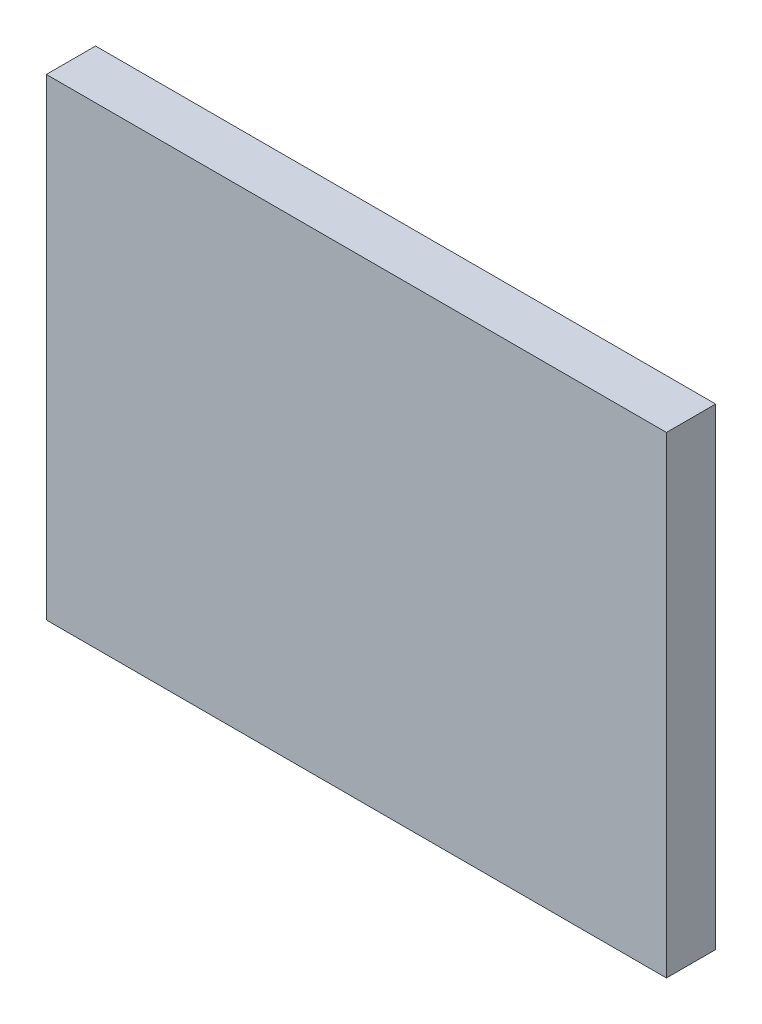
ISO-10303-21;
HEADER;
FILE_DESCRIPTION(('STEP AP214'),'2;1');
FILE_NAME('part.step','',(''),(''),'','','');
FILE_SCHEMA(('AUTOMOTIVE_DESIGN { 1 0 10303 214 1 1 1 1 }'));
ENDSEC;
DATA;
#1=APPLICATION_CONTEXT('core data for automotive mechanical design processes');
#2=APPLICATION_PROTOCOL_DEFINITION('international standard','automotive_design',2000,#1);
#3=PRODUCT_CONTEXT('',#1,'mechanical');
#4=PRODUCT('Part','Part','',(#3));
#5=PRODUCT_RELATED_PRODUCT_CATEGORY('part','',(#4));
#6=PRODUCT_DEFINITION_FORMATION('','',#4);
#7=PRODUCT_DEFINITION_CONTEXT('part definition',#1,'design');
#8=PRODUCT_DEFINITION('design','',#6,#7);
#9=PRODUCT_DEFINITION_SHAPE('','',#8);
#10=(LENGTH_UNIT() NAMED_UNIT(*) SI_UNIT(.MILLI.,.METRE.));
#11=(NAMED_UNIT(*) PLANE_ANGLE_UNIT() SI_UNIT($,.RADIAN.));
#12=(NAMED_UNIT(*) SI_UNIT($,.STERADIAN.) SOLID_ANGLE_UNIT());
#13=UNCERTAINTY_MEASURE_WITH_UNIT(LENGTH_MEASURE(1.E-05),#10,'distance_accuracy_value','');
#14=(GEOMETRIC_REPRESENTATION_CONTEXT(3) GLOBAL_UNCERTAINTY_ASSIGNED_CONTEXT((#13)) GLOBAL_UNIT_ASSIGNED_CONTEXT((#10,
#11,#12)) REPRESENTATION_CONTEXT('',''));
#15=CARTESIAN_POINT('',(0.,0.,0.));
#16=DIRECTION('',(0.,0.,1.));
#17=DIRECTION('',(1.,0.,0.));
#18=AXIS2_PLACEMENT_3D('',#15,#16,#17);
#19=CARTESIAN_POINT('',(1.27,-1.58,0.));
#20=DIRECTION('',(1.,0.,0.));
#21=DIRECTION('',(0.,0.,1.));
#22=AXIS2_PLACEMENT_3D('',#19,#20,#21);
#23=PLANE('',#22);
#24=DIRECTION('',(0.,1.,0.));
#25=VECTOR('',#24,1.);
#26=CARTESIAN_POINT('',(1.27,-1.58,0.1));
#27=LINE('',#26,#25);
#28=CARTESIAN_POINT('',(1.27,-1.58,0.1));
#29=VERTEX_POINT('',#28);
#30=CARTESIAN_POINT('',(1.27,-0.62,0.1));
#31=VERTEX_POINT('',#30);
#32=EDGE_CURVE('E11',#29,#31,#27,.T.);
#33=ORIENTED_EDGE('',*,*,#32,.T.);
#34=DIRECTION('',(0.,0.,1.));
#35=VECTOR('',#34,1.);
#36=CARTESIAN_POINT('',(1.27,-0.62,0.));
#37=LINE('',#36,#35);
#38=CARTESIAN_POINT('',(1.27,-0.62,0.));
#39=VERTEX_POINT('',#38);
#40=EDGE_CURVE('E23',#39,#31,#37,.T.);
#41=ORIENTED_EDGE('',*,*,#40,.F.);
#42=DIRECTION('',(0.,1.,0.));
#43=VECTOR('',#42,1.);
#44=CARTESIAN_POINT('',(1.27,-1.58,0.));
#45=LINE('',#44,#43);
#46=CARTESIAN_POINT('',(1.27,-1.58,0.));
#47=VERTEX_POINT('',#46);
#48=EDGE_CURVE('E85',#47,#39,#45,.T.);
#49=ORIENTED_EDGE('',*,*,#48,.F.);
#50=DIRECTION('',(0.,0.,1.));
#51=VECTOR('',#50,1.);
#52=CARTESIAN_POINT('',(1.27,-1.58,0.));
#53=LINE('',#52,#51);
#54=EDGE_CURVE('E35',#47,#29,#53,.T.);
#55=ORIENTED_EDGE('',*,*,#54,.T.);
#56=EDGE_LOOP('',(#33,#41,#49,#55));
#57=FACE_BOUND('',#56,.T.);
#58=ADVANCED_FACE('F16',(#57),#23,.F.);
#59=CARTESIAN_POINT('',(2.53,-1.58,0.));
#60=DIRECTION('',(1.,0.,0.));
#61=DIRECTION('',(0.,0.,1.));
#62=AXIS2_PLACEMENT_3D('',#59,#60,#61);
#63=PLANE('',#62);
#64=DIRECTION('',(0.,0.,1.));
#65=VECTOR('',#64,1.);
#66=CARTESIAN_POINT('',(2.53,-1.58,0.));
#67=LINE('',#66,#65);
#68=CARTESIAN_POINT('',(2.53,-1.58,0.));
#69=VERTEX_POINT('',#68);
#70=CARTESIAN_POINT('',(2.53,-1.58,0.1));
#71=VERTEX_POINT('',#70);
#72=EDGE_CURVE('E82',#69,#71,#67,.T.);
#73=ORIENTED_EDGE('',*,*,#72,.F.);
#74=DIRECTION('',(0.,1.,0.));
#75=VECTOR('',#74,1.);
#76=CARTESIAN_POINT('',(2.53,-1.58,0.));
#77=LINE('',#76,#75);
#78=CARTESIAN_POINT('',(2.53,-0.62,0.));
#79=VERTEX_POINT('',#78);
#80=EDGE_CURVE('E62',#69,#79,#77,.T.);
#81=ORIENTED_EDGE('',*,*,#80,.T.);
#82=DIRECTION('',(0.,0.,1.));
#83=VECTOR('',#82,1.);
#84=CARTESIAN_POINT('',(2.53,-0.62,0.));
#85=LINE('',#84,#83);
#86=CARTESIAN_POINT('',(2.53,-0.62,0.1));
#87=VERTEX_POINT('',#86);
#88=EDGE_CURVE('E56',#79,#87,#85,.T.);
#89=ORIENTED_EDGE('',*,*,#88,.T.);
#90=DIRECTION('',(0.,1.,0.));
#91=VECTOR('',#90,1.);
#92=CARTESIAN_POINT('',(2.53,-1.58,0.1));
#93=LINE('',#92,#91);
#94=EDGE_CURVE('E59',#71,#87,#93,.T.);
#95=ORIENTED_EDGE('',*,*,#94,.F.);
#96=EDGE_LOOP('',(#73,#81,#89,#95));
#97=FACE_BOUND('',#96,.T.);
#98=ADVANCED_FACE('F58',(#97),#63,.T.);
#99=CARTESIAN_POINT('',(1.27,-1.58,0.));
#100=DIRECTION('',(0.,1.,0.));
#101=DIRECTION('',(0.,0.,1.));
#102=AXIS2_PLACEMENT_3D('',#99,#100,#101);
#103=PLANE('',#102);
#104=ORIENTED_EDGE('',*,*,#72,.T.);
#105=DIRECTION('',(1.,0.,0.));
#106=VECTOR('',#105,1.);
#107=CARTESIAN_POINT('',(1.27,-1.58,0.1));
#108=LINE('',#107,#106);
#109=EDGE_CURVE('E70',#29,#71,#108,.T.);
#110=ORIENTED_EDGE('',*,*,#109,.F.);
#111=ORIENTED_EDGE('',*,*,#54,.F.);
#112=DIRECTION('',(1.,0.,0.));
#113=VECTOR('',#112,1.);
#114=CARTESIAN_POINT('',(1.27,-1.58,0.));
#115=LINE('',#114,#113);
#116=EDGE_CURVE('E75',#47,#69,#115,.T.);
#117=ORIENTED_EDGE('',*,*,#116,.T.);
#118=EDGE_LOOP('',(#104,#110,#111,#117));
#119=FACE_BOUND('',#118,.T.);
#120=ADVANCED_FACE('F90',(#119),#103,.F.);
#121=CARTESIAN_POINT('',(1.27,-0.62,0.));
#122=DIRECTION('',(0.,1.,0.));
#123=DIRECTION('',(0.,0.,1.));
#124=AXIS2_PLACEMENT_3D('',#121,#122,#123);
#125=PLANE('',#124);
#126=DIRECTION('',(1.,0.,0.));
#127=VECTOR('',#126,1.);
#128=CARTESIAN_POINT('',(1.27,-0.62,0.));
#129=LINE('',#128,#127);
#130=EDGE_CURVE('E73',#39,#79,#129,.T.);
#131=ORIENTED_EDGE('',*,*,#130,.F.);
#132=ORIENTED_EDGE('',*,*,#40,.T.);
#133=DIRECTION('',(1.,0.,0.));
#134=VECTOR('',#133,1.);
#135=CARTESIAN_POINT('',(1.27,-0.62,0.1));
#136=LINE('',#135,#134);
#137=EDGE_CURVE('E68',#31,#87,#136,.T.);
#138=ORIENTED_EDGE('',*,*,#137,.T.);
#139=ORIENTED_EDGE('',*,*,#88,.F.);
#140=EDGE_LOOP('',(#131,#132,#138,#139));
#141=FACE_BOUND('',#140,.T.);
#142=ADVANCED_FACE('F72',(#141),#125,.T.);
#143=CARTESIAN_POINT('',(1.27,-1.58,0.));
#144=DIRECTION('',(0.,0.,1.));
#145=DIRECTION('',(1.,0.,0.));
#146=AXIS2_PLACEMENT_3D('',#143,#144,#145);
#147=PLANE('',#146);
#148=ORIENTED_EDGE('',*,*,#130,.T.);
#149=ORIENTED_EDGE('',*,*,#80,.F.);
#150=ORIENTED_EDGE('',*,*,#116,.F.);
#151=ORIENTED_EDGE('',*,*,#48,.T.);
#152=EDGE_LOOP('',(#148,#149,#150,#151));
#153=FACE_BOUND('',#152,.T.);
#154=ADVANCED_FACE('F88',(#153),#147,.F.);
#155=CARTESIAN_POINT('',(1.27,-1.58,0.1));
#156=DIRECTION('',(0.,0.,1.));
#157=DIRECTION('',(1.,0.,0.));
#158=AXIS2_PLACEMENT_3D('',#155,#156,#157);
#159=PLANE('',#158);
#160=ORIENTED_EDGE('',*,*,#32,.F.);
#161=ORIENTED_EDGE('',*,*,#109,.T.);
#162=ORIENTED_EDGE('',*,*,#94,.T.);
#163=ORIENTED_EDGE('',*,*,#137,.F.);
#164=EDGE_LOOP('',(#160,#161,#162,#163));
#165=FACE_BOUND('',#164,.T.);
#166=ADVANCED_FACE('F67',(#165),#159,.T.);
#167=CLOSED_SHELL('',(#58,#98,#120,#142,#154,#166));
#168=MANIFOLD_SOLID_BREP('B1',#167);
#169=ADVANCED_BREP_SHAPE_REPRESENTATION('',(#18,#168),#14);
#170=SHAPE_DEFINITION_REPRESENTATION(#9,#169);
ENDSEC;
END-ISO-10303-21;
